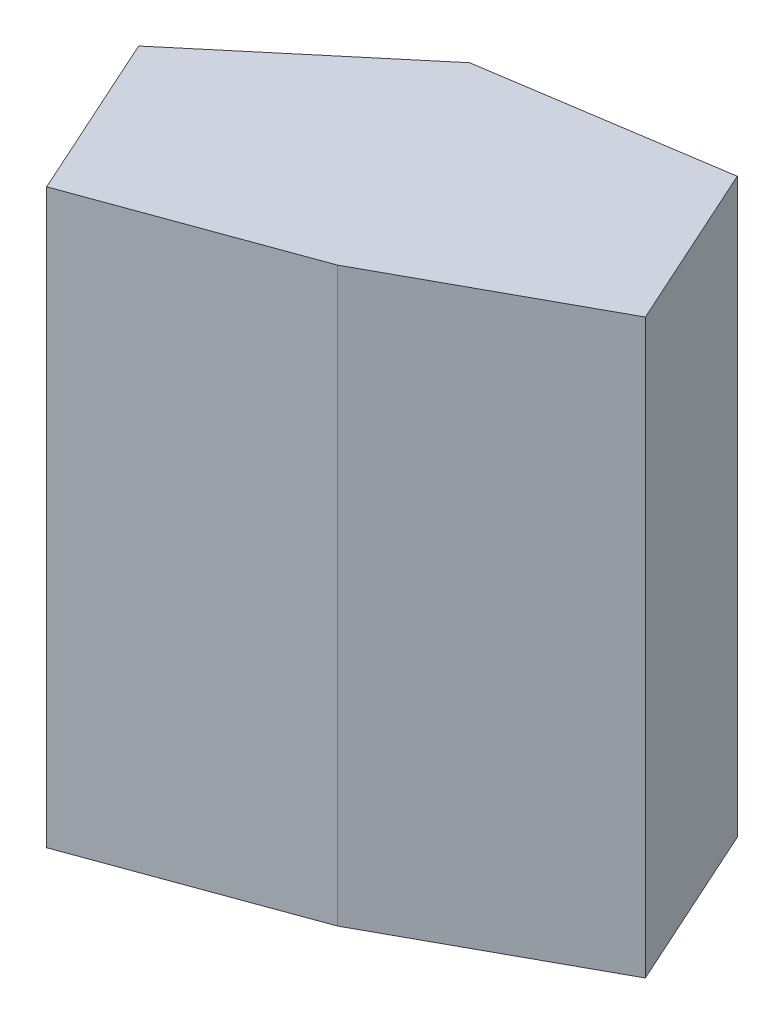
ISO-10303-21;
HEADER;
FILE_DESCRIPTION(('STEP AP214'),'2;1');
FILE_NAME('part.step','',(''),(''),'','','');
FILE_SCHEMA(('AUTOMOTIVE_DESIGN { 1 0 10303 214 1 1 1 1 }'));
ENDSEC;
DATA;
#1=APPLICATION_CONTEXT('core data for automotive mechanical design processes');
#2=APPLICATION_PROTOCOL_DEFINITION('international standard','automotive_design',2000,#1);
#3=PRODUCT_CONTEXT('',#1,'mechanical');
#4=PRODUCT('Part','Part','',(#3));
#5=PRODUCT_RELATED_PRODUCT_CATEGORY('part','',(#4));
#6=PRODUCT_DEFINITION_FORMATION('','',#4);
#7=PRODUCT_DEFINITION_CONTEXT('part definition',#1,'design');
#8=PRODUCT_DEFINITION('design','',#6,#7);
#9=PRODUCT_DEFINITION_SHAPE('','',#8);
#10=(LENGTH_UNIT() NAMED_UNIT(*) SI_UNIT(.MILLI.,.METRE.));
#11=(NAMED_UNIT(*) PLANE_ANGLE_UNIT() SI_UNIT($,.RADIAN.));
#12=(NAMED_UNIT(*) SI_UNIT($,.STERADIAN.) SOLID_ANGLE_UNIT());
#13=UNCERTAINTY_MEASURE_WITH_UNIT(LENGTH_MEASURE(1.E-05),#10,'distance_accuracy_value','');
#14=(GEOMETRIC_REPRESENTATION_CONTEXT(3) GLOBAL_UNCERTAINTY_ASSIGNED_CONTEXT((#13)) GLOBAL_UNIT_ASSIGNED_CONTEXT((#10,
#11,#12)) REPRESENTATION_CONTEXT('',''));
#15=CARTESIAN_POINT('',(0.,0.,0.));
#16=DIRECTION('',(0.,0.,1.));
#17=DIRECTION('',(1.,0.,0.));
#18=AXIS2_PLACEMENT_3D('',#15,#16,#17);
#19=CARTESIAN_POINT('',(9.34793553563478,6.5,-7.84384926021994));
#20=DIRECTION('',(0.91106036568361,0.,-0.412272980051381));
#21=DIRECTION('',(-0.412272980051381,0.,-0.91106036568361));
#22=AXIS2_PLACEMENT_3D('',#19,#20,#21);
#23=PLANE('',#22);
#24=DIRECTION('',(0.412272980051381,0.,0.91106036568361));
#25=VECTOR('',#24,1.);
#26=CARTESIAN_POINT('',(9.34793553563478,-6.5,-7.84384926021994));
#27=LINE('',#26,#25);
#28=CARTESIAN_POINT('',(9.34793553563478,-6.5,-7.84384926021994));
#29=VERTEX_POINT('',#28);
#30=CARTESIAN_POINT('',(11.0735741143516,-6.5,-4.03045136456456));
#31=VERTEX_POINT('',#30);
#32=EDGE_CURVE('E114',#29,#31,#27,.T.);
#33=ORIENTED_EDGE('',*,*,#32,.T.);
#34=DIRECTION('',(0.,-1.,0.));
#35=VECTOR('',#34,1.);
#36=CARTESIAN_POINT('',(11.0735741143516,6.5,-4.03045136456456));
#37=LINE('',#36,#35);
#38=CARTESIAN_POINT('',(11.0735741143516,6.5,-4.03045136456456));
#39=VERTEX_POINT('',#38);
#40=EDGE_CURVE('E11',#39,#31,#37,.T.);
#41=ORIENTED_EDGE('',*,*,#40,.F.);
#42=DIRECTION('',(0.412272980051381,0.,0.91106036568361));
#43=VECTOR('',#42,1.);
#44=CARTESIAN_POINT('',(9.34793553563478,6.5,-7.84384926021994));
#45=LINE('',#44,#43);
#46=CARTESIAN_POINT('',(9.34793553563478,6.5,-7.84384926021994));
#47=VERTEX_POINT('',#46);
#48=EDGE_CURVE('E131',#47,#39,#45,.T.);
#49=ORIENTED_EDGE('',*,*,#48,.F.);
#50=DIRECTION('',(0.,-1.,0.));
#51=VECTOR('',#50,1.);
#52=CARTESIAN_POINT('',(9.34793553563478,6.5,-7.84384926021994));
#53=LINE('',#52,#51);
#54=EDGE_CURVE('E47',#47,#29,#53,.T.);
#55=ORIENTED_EDGE('',*,*,#54,.T.);
#56=EDGE_LOOP('',(#33,#41,#49,#55));
#57=FACE_BOUND('',#56,.T.);
#58=ADVANCED_FACE('F39',(#57),#23,.F.);
#59=CARTESIAN_POINT('',(11.0735741143516,6.5,-4.03045136456456));
#60=DIRECTION('',(-0.342020143325657,0.,-0.939692620785913));
#61=DIRECTION('',(-0.939692620785913,0.,0.342020143325657));
#62=AXIS2_PLACEMENT_3D('',#59,#60,#61);
#63=PLANE('',#62);
#64=DIRECTION('',(0.939692620785913,0.,-0.342020143325657));
#65=VECTOR('',#64,1.);
#66=CARTESIAN_POINT('',(11.0735741143516,-6.5,-4.03045136456456));
#67=LINE('',#66,#65);
#68=CARTESIAN_POINT('',(15.9150795598671,-6.5,-5.79261523576983));
#69=VERTEX_POINT('',#68);
#70=EDGE_CURVE('E137',#31,#69,#67,.T.);
#71=ORIENTED_EDGE('',*,*,#70,.T.);
#72=DIRECTION('',(0.,-1.,0.));
#73=VECTOR('',#72,1.);
#74=CARTESIAN_POINT('',(15.9150795598671,6.5,-5.79261523576983));
#75=LINE('',#74,#73);
#76=CARTESIAN_POINT('',(15.9150795598671,6.5,-5.79261523576984));
#77=VERTEX_POINT('',#76);
#78=EDGE_CURVE('E115',#77,#69,#75,.T.);
#79=ORIENTED_EDGE('',*,*,#78,.F.);
#80=DIRECTION('',(0.939692620785913,0.,-0.342020143325657));
#81=VECTOR('',#80,1.);
#82=CARTESIAN_POINT('',(11.0735741143516,6.5,-4.03045136456456));
#83=LINE('',#82,#81);
#84=EDGE_CURVE('E79',#39,#77,#83,.T.);
#85=ORIENTED_EDGE('',*,*,#84,.F.);
#86=ORIENTED_EDGE('',*,*,#40,.T.);
#87=EDGE_LOOP('',(#71,#79,#85,#86));
#88=FACE_BOUND('',#87,.T.);
#89=ADVANCED_FACE('F146',(#88),#63,.F.);
#90=CARTESIAN_POINT('',(13.4345786490416,6.5,-11.2729499894327));
#91=DIRECTION('',(0.642787609686529,0.,0.766044443118986));
#92=DIRECTION('',(0.766044443118986,0.,-0.64278760968653));
#93=AXIS2_PLACEMENT_3D('',#90,#91,#92);
#94=PLANE('',#93);
#95=DIRECTION('',(-0.766044443118986,0.,0.64278760968653));
#96=VECTOR('',#95,1.);
#97=CARTESIAN_POINT('',(13.4345786490416,-6.5,-11.2729499894327));
#98=LINE('',#97,#96);
#99=CARTESIAN_POINT('',(13.4345786490416,-6.5,-11.2729499894327));
#100=VERTEX_POINT('',#99);
#101=EDGE_CURVE('E72',#100,#29,#98,.T.);
#102=ORIENTED_EDGE('',*,*,#101,.T.);
#103=ORIENTED_EDGE('',*,*,#54,.F.);
#104=DIRECTION('',(-0.766044443118986,0.,0.64278760968653));
#105=VECTOR('',#104,1.);
#106=CARTESIAN_POINT('',(13.4345786490416,6.5,-11.2729499894327));
#107=LINE('',#106,#105);
#108=CARTESIAN_POINT('',(13.4345786490416,6.5,-11.2729499894327));
#109=VERTEX_POINT('',#108);
#110=EDGE_CURVE('E55',#109,#47,#107,.T.);
#111=ORIENTED_EDGE('',*,*,#110,.F.);
#112=DIRECTION('',(0.,-1.,0.));
#113=VECTOR('',#112,1.);
#114=CARTESIAN_POINT('',(13.4345786490416,6.5,-11.2729499894327));
#115=LINE('',#114,#113);
#116=EDGE_CURVE('E69',#109,#100,#115,.T.);
#117=ORIENTED_EDGE('',*,*,#116,.T.);
#118=EDGE_LOOP('',(#102,#103,#111,#117));
#119=FACE_BOUND('',#118,.T.);
#120=ADVANCED_FACE('F148',(#119),#94,.F.);
#121=CARTESIAN_POINT('',(0.,6.5,0.));
#122=DIRECTION('',(0.,1.,0.));
#123=DIRECTION('',(0.,0.,1.));
#124=AXIS2_PLACEMENT_3D('',#121,#122,#123);
#125=PLANE('',#124);
#126=ORIENTED_EDGE('',*,*,#48,.T.);
#127=ORIENTED_EDGE('',*,*,#84,.T.);
#128=DIRECTION('',(-0.877106141495865,0.,0.480296592274227));
#129=VECTOR('',#128,1.);
#130=CARTESIAN_POINT('',(20.4341255398128,6.5,-8.26721013576316));
#131=LINE('',#130,#129);
#132=CARTESIAN_POINT('',(20.4341255398128,6.5,-8.26721013576316));
#133=VERTEX_POINT('',#132);
#134=EDGE_CURVE('E96',#133,#77,#131,.T.);
#135=ORIENTED_EDGE('',*,*,#134,.F.);
#136=DIRECTION('',(0.412422040235345,0.,0.910992898286324));
#137=VECTOR('',#136,1.);
#138=CARTESIAN_POINT('',(18.7078630443795,6.5,-12.0803256351685));
#139=LINE('',#138,#137);
#140=CARTESIAN_POINT('',(18.7078630443795,6.5,-12.0803256351685));
#141=VERTEX_POINT('',#140);
#142=EDGE_CURVE('E100',#141,#133,#139,.T.);
#143=ORIENTED_EDGE('',*,*,#142,.F.);
#144=DIRECTION('',(0.988481278138127,0.,-0.151343195322469));
#145=VECTOR('',#144,1.);
#146=CARTESIAN_POINT('',(13.4345786490416,6.5,-11.2729499894327));
#147=LINE('',#146,#145);
#148=EDGE_CURVE('E104',#109,#141,#147,.T.);
#149=ORIENTED_EDGE('',*,*,#148,.F.);
#150=ORIENTED_EDGE('',*,*,#110,.T.);
#151=EDGE_LOOP('',(#126,#127,#135,#143,#149,#150));
#152=FACE_BOUND('',#151,.T.);
#153=ADVANCED_FACE('F98',(#152),#125,.T.);
#154=CARTESIAN_POINT('',(0.,-6.5,0.));
#155=DIRECTION('',(0.,1.,0.));
#156=DIRECTION('',(0.,0.,1.));
#157=AXIS2_PLACEMENT_3D('',#154,#155,#156);
#158=PLANE('',#157);
#159=ORIENTED_EDGE('',*,*,#32,.F.);
#160=ORIENTED_EDGE('',*,*,#101,.F.);
#161=DIRECTION('',(0.988481278138127,0.,-0.151343195322469));
#162=VECTOR('',#161,1.);
#163=CARTESIAN_POINT('',(13.4345786490416,-6.5,-11.2729499894327));
#164=LINE('',#163,#162);
#165=CARTESIAN_POINT('',(18.7078630443795,-6.5,-12.0803256351685));
#166=VERTEX_POINT('',#165);
#167=EDGE_CURVE('E120',#100,#166,#164,.T.);
#168=ORIENTED_EDGE('',*,*,#167,.T.);
#169=DIRECTION('',(0.412422040235345,0.,0.910992898286324));
#170=VECTOR('',#169,1.);
#171=CARTESIAN_POINT('',(18.7078630443795,-6.5,-12.0803256351685));
#172=LINE('',#171,#170);
#173=CARTESIAN_POINT('',(20.4341255398128,-6.5,-8.26721013576316));
#174=VERTEX_POINT('',#173);
#175=EDGE_CURVE('E125',#166,#174,#172,.T.);
#176=ORIENTED_EDGE('',*,*,#175,.T.);
#177=DIRECTION('',(-0.877106141495865,0.,0.480296592274227));
#178=VECTOR('',#177,1.);
#179=CARTESIAN_POINT('',(20.4341255398128,-6.5,-8.26721013576316));
#180=LINE('',#179,#178);
#181=EDGE_CURVE('E110',#174,#69,#180,.T.);
#182=ORIENTED_EDGE('',*,*,#181,.T.);
#183=ORIENTED_EDGE('',*,*,#70,.F.);
#184=EDGE_LOOP('',(#159,#160,#168,#176,#182,#183));
#185=FACE_BOUND('',#184,.T.);
#186=ADVANCED_FACE('F144',(#185),#158,.F.);
#187=CARTESIAN_POINT('',(18.7078630443795,6.5,-12.0803256351685));
#188=DIRECTION('',(-0.910992898286323,0.,0.412422040235345));
#189=DIRECTION('',(-0.412422040235345,0.,-0.910992898286324));
#190=AXIS2_PLACEMENT_3D('',#187,#188,#189);
#191=PLANE('',#190);
#192=ORIENTED_EDGE('',*,*,#175,.F.);
#193=DIRECTION('',(0.,-1.,0.));
#194=VECTOR('',#193,1.);
#195=CARTESIAN_POINT('',(18.7078630443795,6.5,-12.0803256351685));
#196=LINE('',#195,#194);
#197=EDGE_CURVE('E119',#141,#166,#196,.T.);
#198=ORIENTED_EDGE('',*,*,#197,.F.);
#199=ORIENTED_EDGE('',*,*,#142,.T.);
#200=DIRECTION('',(0.,-1.,0.));
#201=VECTOR('',#200,1.);
#202=CARTESIAN_POINT('',(20.4341255398128,6.5,-8.26721013576316));
#203=LINE('',#202,#201);
#204=EDGE_CURVE('E107',#133,#174,#203,.T.);
#205=ORIENTED_EDGE('',*,*,#204,.T.);
#206=EDGE_LOOP('',(#192,#198,#199,#205));
#207=FACE_BOUND('',#206,.T.);
#208=ADVANCED_FACE('F117',(#207),#191,.F.);
#209=CARTESIAN_POINT('',(20.4341255398128,6.5,-8.26721013576316));
#210=DIRECTION('',(-0.480296592274227,0.,-0.877106141495866));
#211=DIRECTION('',(0.877106141495865,0.,-0.480296592274227));
#212=AXIS2_PLACEMENT_3D('',#209,#210,#211);
#213=PLANE('',#212);
#214=ORIENTED_EDGE('',*,*,#181,.F.);
#215=ORIENTED_EDGE('',*,*,#204,.F.);
#216=ORIENTED_EDGE('',*,*,#134,.T.);
#217=ORIENTED_EDGE('',*,*,#78,.T.);
#218=EDGE_LOOP('',(#214,#215,#216,#217));
#219=FACE_BOUND('',#218,.T.);
#220=ADVANCED_FACE('F108',(#219),#213,.F.);
#221=CARTESIAN_POINT('',(13.4345786490416,6.5,-11.2729499894327));
#222=DIRECTION('',(0.151343195322469,0.,0.988481278138127));
#223=DIRECTION('',(-0.988481278138127,0.,0.151343195322469));
#224=AXIS2_PLACEMENT_3D('',#221,#222,#223);
#225=PLANE('',#224);
#226=ORIENTED_EDGE('',*,*,#167,.F.);
#227=ORIENTED_EDGE('',*,*,#116,.F.);
#228=ORIENTED_EDGE('',*,*,#148,.T.);
#229=ORIENTED_EDGE('',*,*,#197,.T.);
#230=EDGE_LOOP('',(#226,#227,#228,#229));
#231=FACE_BOUND('',#230,.T.);
#232=ADVANCED_FACE('F164',(#231),#225,.F.);
#233=CLOSED_SHELL('',(#58,#89,#120,#153,#186,#208,#220,#232));
#234=MANIFOLD_SOLID_BREP('B2',#233);
#235=ADVANCED_BREP_SHAPE_REPRESENTATION('',(#18,#234),#14);
#236=SHAPE_DEFINITION_REPRESENTATION(#9,#235);
ENDSEC;
END-ISO-10303-21;
